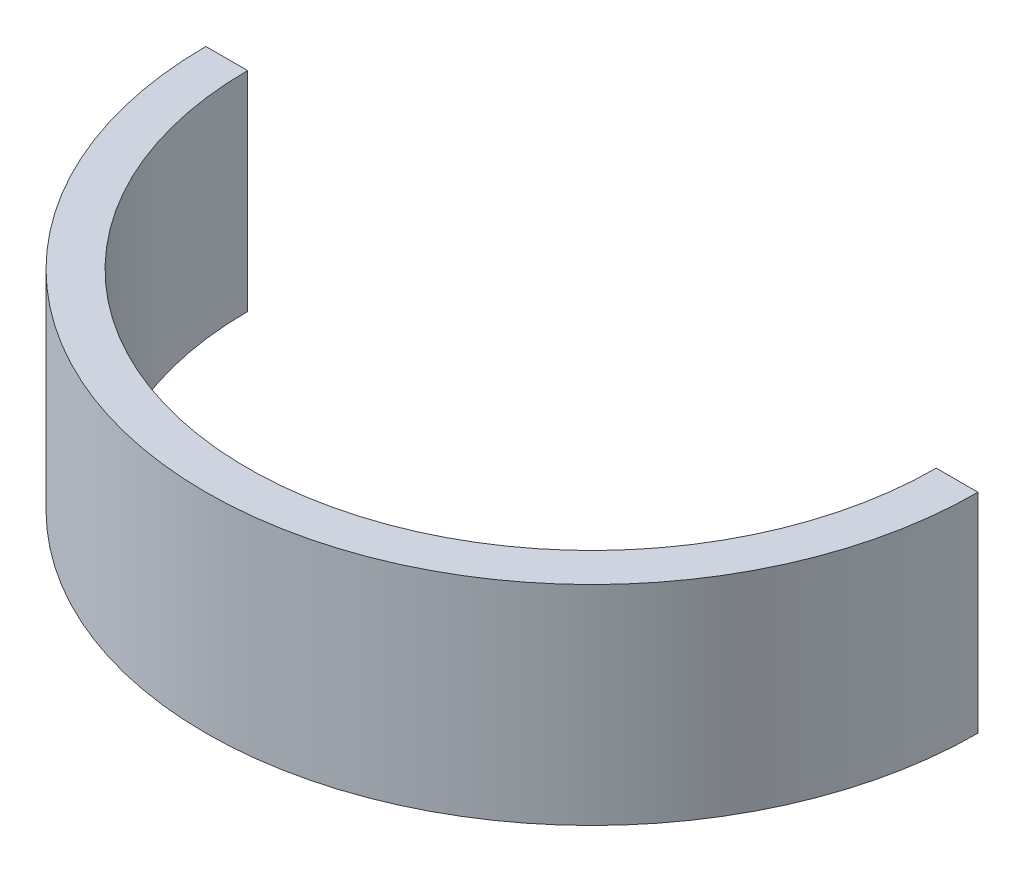
ISO-10303-21;
HEADER;
FILE_DESCRIPTION(('STEP AP214'),'2;1');
FILE_NAME('part.step','',(''),(''),'','','');
FILE_SCHEMA(('AUTOMOTIVE_DESIGN { 1 0 10303 214 1 1 1 1 }'));
ENDSEC;
DATA;
#1=APPLICATION_CONTEXT('core data for automotive mechanical design processes');
#2=APPLICATION_PROTOCOL_DEFINITION('international standard','automotive_design',2000,#1);
#3=PRODUCT_CONTEXT('',#1,'mechanical');
#4=PRODUCT('Part','Part','',(#3));
#5=PRODUCT_RELATED_PRODUCT_CATEGORY('part','',(#4));
#6=PRODUCT_DEFINITION_FORMATION('','',#4);
#7=PRODUCT_DEFINITION_CONTEXT('part definition',#1,'design');
#8=PRODUCT_DEFINITION('design','',#6,#7);
#9=PRODUCT_DEFINITION_SHAPE('','',#8);
#10=(LENGTH_UNIT() NAMED_UNIT(*) SI_UNIT(.MILLI.,.METRE.));
#11=(NAMED_UNIT(*) PLANE_ANGLE_UNIT() SI_UNIT($,.RADIAN.));
#12=(NAMED_UNIT(*) SI_UNIT($,.STERADIAN.) SOLID_ANGLE_UNIT());
#13=UNCERTAINTY_MEASURE_WITH_UNIT(LENGTH_MEASURE(1.E-05),#10,'distance_accuracy_value','');
#14=(GEOMETRIC_REPRESENTATION_CONTEXT(3) GLOBAL_UNCERTAINTY_ASSIGNED_CONTEXT((#13)) GLOBAL_UNIT_ASSIGNED_CONTEXT((#10,
#11,#12)) REPRESENTATION_CONTEXT('',''));
#15=CARTESIAN_POINT('',(0.,0.,0.));
#16=DIRECTION('',(0.,0.,1.));
#17=DIRECTION('',(1.,0.,0.));
#18=AXIS2_PLACEMENT_3D('',#15,#16,#17);
#19=CARTESIAN_POINT('',(0.,40.,0.));
#20=DIRECTION('',(0.,-1.,0.));
#21=DIRECTION('',(0.,0.,-1.));
#22=AXIS2_PLACEMENT_3D('',#19,#20,#21);
#23=CYLINDRICAL_SURFACE('',#22,66.);
#24=CARTESIAN_POINT('',(0.,0.,0.));
#25=DIRECTION('',(0.,-1.,0.));
#26=DIRECTION('',(0.,0.,1.));
#27=AXIS2_PLACEMENT_3D('',#24,#25,#26);
#28=CIRCLE('',#27,66.);
#29=CARTESIAN_POINT('',(66.,0.,0.));
#30=VERTEX_POINT('',#29);
#31=CARTESIAN_POINT('',(-66.,0.,0.));
#32=VERTEX_POINT('',#31);
#33=EDGE_CURVE('E107',#30,#32,#28,.T.);
#34=ORIENTED_EDGE('',*,*,#33,.T.);
#35=DIRECTION('',(0.,-1.,0.));
#36=VECTOR('',#35,1.);
#37=CARTESIAN_POINT('',(-66.,40.,0.));
#38=LINE('',#37,#36);
#39=CARTESIAN_POINT('',(-66.,40.,0.));
#40=VERTEX_POINT('',#39);
#41=EDGE_CURVE('E11',#40,#32,#38,.T.);
#42=ORIENTED_EDGE('',*,*,#41,.F.);
#43=CARTESIAN_POINT('',(0.,40.,0.));
#44=DIRECTION('',(0.,-1.,0.));
#45=DIRECTION('',(0.,0.,1.));
#46=AXIS2_PLACEMENT_3D('',#43,#44,#45);
#47=CIRCLE('',#46,66.);
#48=CARTESIAN_POINT('',(66.,40.,0.));
#49=VERTEX_POINT('',#48);
#50=EDGE_CURVE('E91',#49,#40,#47,.T.);
#51=ORIENTED_EDGE('',*,*,#50,.F.);
#52=DIRECTION('',(0.,-1.,0.));
#53=VECTOR('',#52,1.);
#54=CARTESIAN_POINT('',(66.,40.,0.));
#55=LINE('',#54,#53);
#56=EDGE_CURVE('E103',#49,#30,#55,.T.);
#57=ORIENTED_EDGE('',*,*,#56,.T.);
#58=EDGE_LOOP('',(#34,#42,#51,#57));
#59=FACE_BOUND('',#58,.T.);
#60=ADVANCED_FACE('F39',(#59),#23,.F.);
#61=CARTESIAN_POINT('',(-74.,40.,0.));
#62=DIRECTION('',(0.,0.,1.));
#63=DIRECTION('',(1.,0.,0.));
#64=AXIS2_PLACEMENT_3D('',#61,#62,#63);
#65=PLANE('',#64);
#66=DIRECTION('',(-1.,0.,0.));
#67=VECTOR('',#66,1.);
#68=CARTESIAN_POINT('',(-74.,0.,0.));
#69=LINE('',#68,#67);
#70=CARTESIAN_POINT('',(-74.,0.,0.));
#71=VERTEX_POINT('',#70);
#72=EDGE_CURVE('E96',#32,#71,#69,.T.);
#73=ORIENTED_EDGE('',*,*,#72,.T.);
#74=DIRECTION('',(0.,-1.,0.));
#75=VECTOR('',#74,1.);
#76=CARTESIAN_POINT('',(-74.,40.,0.));
#77=LINE('',#76,#75);
#78=CARTESIAN_POINT('',(-74.,40.,0.));
#79=VERTEX_POINT('',#78);
#80=EDGE_CURVE('E48',#79,#71,#77,.T.);
#81=ORIENTED_EDGE('',*,*,#80,.F.);
#82=DIRECTION('',(-1.,0.,0.));
#83=VECTOR('',#82,1.);
#84=CARTESIAN_POINT('',(-74.,40.,0.));
#85=LINE('',#84,#83);
#86=EDGE_CURVE('E86',#40,#79,#85,.T.);
#87=ORIENTED_EDGE('',*,*,#86,.F.);
#88=ORIENTED_EDGE('',*,*,#41,.T.);
#89=EDGE_LOOP('',(#73,#81,#87,#88));
#90=FACE_BOUND('',#89,.T.);
#91=ADVANCED_FACE('F95',(#90),#65,.F.);
#92=CARTESIAN_POINT('',(0.,40.,0.));
#93=DIRECTION('',(0.,-1.,0.));
#94=DIRECTION('',(0.,0.,-1.));
#95=AXIS2_PLACEMENT_3D('',#92,#93,#94);
#96=CYLINDRICAL_SURFACE('',#95,74.);
#97=CARTESIAN_POINT('',(0.,0.,0.));
#98=DIRECTION('',(0.,1.,0.));
#99=DIRECTION('',(0.,0.,1.));
#100=AXIS2_PLACEMENT_3D('',#97,#98,#99);
#101=CIRCLE('',#100,74.);
#102=CARTESIAN_POINT('',(74.,0.,0.));
#103=VERTEX_POINT('',#102);
#104=EDGE_CURVE('E73',#71,#103,#101,.T.);
#105=ORIENTED_EDGE('',*,*,#104,.T.);
#106=DIRECTION('',(0.,-1.,0.));
#107=VECTOR('',#106,1.);
#108=CARTESIAN_POINT('',(74.,40.,0.));
#109=LINE('',#108,#107);
#110=CARTESIAN_POINT('',(74.,40.,0.));
#111=VERTEX_POINT('',#110);
#112=EDGE_CURVE('E98',#111,#103,#109,.T.);
#113=ORIENTED_EDGE('',*,*,#112,.F.);
#114=CARTESIAN_POINT('',(0.,40.,0.));
#115=DIRECTION('',(0.,1.,0.));
#116=DIRECTION('',(0.,0.,1.));
#117=AXIS2_PLACEMENT_3D('',#114,#115,#116);
#118=CIRCLE('',#117,74.);
#119=EDGE_CURVE('E89',#79,#111,#118,.T.);
#120=ORIENTED_EDGE('',*,*,#119,.F.);
#121=ORIENTED_EDGE('',*,*,#80,.T.);
#122=EDGE_LOOP('',(#105,#113,#120,#121));
#123=FACE_BOUND('',#122,.T.);
#124=ADVANCED_FACE('F99',(#123),#96,.T.);
#125=CARTESIAN_POINT('',(66.,40.,0.));
#126=DIRECTION('',(0.,0.,1.));
#127=DIRECTION('',(1.,0.,0.));
#128=AXIS2_PLACEMENT_3D('',#125,#126,#127);
#129=PLANE('',#128);
#130=DIRECTION('',(-1.,0.,0.));
#131=VECTOR('',#130,1.);
#132=CARTESIAN_POINT('',(66.,0.,0.));
#133=LINE('',#132,#131);
#134=EDGE_CURVE('E79',#103,#30,#133,.T.);
#135=ORIENTED_EDGE('',*,*,#134,.T.);
#136=ORIENTED_EDGE('',*,*,#56,.F.);
#137=DIRECTION('',(-1.,0.,0.));
#138=VECTOR('',#137,1.);
#139=CARTESIAN_POINT('',(66.,40.,0.));
#140=LINE('',#139,#138);
#141=EDGE_CURVE('E56',#111,#49,#140,.T.);
#142=ORIENTED_EDGE('',*,*,#141,.F.);
#143=ORIENTED_EDGE('',*,*,#112,.T.);
#144=EDGE_LOOP('',(#135,#136,#142,#143));
#145=FACE_BOUND('',#144,.T.);
#146=ADVANCED_FACE('F120',(#145),#129,.F.);
#147=CARTESIAN_POINT('',(0.,40.,0.));
#148=DIRECTION('',(0.,1.,0.));
#149=DIRECTION('',(0.,0.,1.));
#150=AXIS2_PLACEMENT_3D('',#147,#148,#149);
#151=PLANE('',#150);
#152=ORIENTED_EDGE('',*,*,#50,.T.);
#153=ORIENTED_EDGE('',*,*,#86,.T.);
#154=ORIENTED_EDGE('',*,*,#119,.T.);
#155=ORIENTED_EDGE('',*,*,#141,.T.);
#156=EDGE_LOOP('',(#152,#153,#154,#155));
#157=FACE_BOUND('',#156,.T.);
#158=ADVANCED_FACE('F87',(#157),#151,.T.);
#159=CARTESIAN_POINT('',(0.,0.,0.));
#160=DIRECTION('',(0.,1.,0.));
#161=DIRECTION('',(0.,0.,1.));
#162=AXIS2_PLACEMENT_3D('',#159,#160,#161);
#163=PLANE('',#162);
#164=ORIENTED_EDGE('',*,*,#33,.F.);
#165=ORIENTED_EDGE('',*,*,#134,.F.);
#166=ORIENTED_EDGE('',*,*,#104,.F.);
#167=ORIENTED_EDGE('',*,*,#72,.F.);
#168=EDGE_LOOP('',(#164,#165,#166,#167));
#169=FACE_BOUND('',#168,.T.);
#170=ADVANCED_FACE('F123',(#169),#163,.F.);
#171=CLOSED_SHELL('',(#60,#91,#124,#146,#158,#170));
#172=MANIFOLD_SOLID_BREP('B2',#171);
#173=ADVANCED_BREP_SHAPE_REPRESENTATION('',(#18,#172),#14);
#174=SHAPE_DEFINITION_REPRESENTATION(#9,#173);
ENDSEC;
END-ISO-10303-21;
